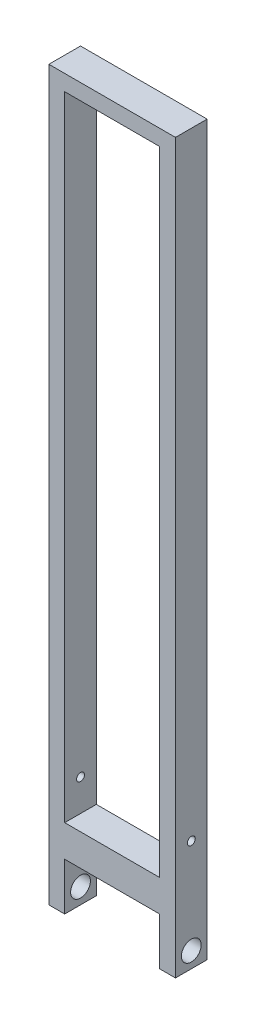
ISO-10303-21;
HEADER;
FILE_DESCRIPTION(('STEP AP214'),'2;1');
FILE_NAME('part.step','',(''),(''),'','','');
FILE_SCHEMA(('AUTOMOTIVE_DESIGN { 1 0 10303 214 1 1 1 1 }'));
ENDSEC;
DATA;
#1=APPLICATION_CONTEXT('core data for automotive mechanical design processes');
#2=APPLICATION_PROTOCOL_DEFINITION('international standard','automotive_design',2000,#1);
#3=PRODUCT_CONTEXT('',#1,'mechanical');
#4=PRODUCT('Part','Part','',(#3));
#5=PRODUCT_RELATED_PRODUCT_CATEGORY('part','',(#4));
#6=PRODUCT_DEFINITION_FORMATION('','',#4);
#7=PRODUCT_DEFINITION_CONTEXT('part definition',#1,'design');
#8=PRODUCT_DEFINITION('design','',#6,#7);
#9=PRODUCT_DEFINITION_SHAPE('','',#8);
#10=(LENGTH_UNIT() NAMED_UNIT(*) SI_UNIT(.MILLI.,.METRE.));
#11=(NAMED_UNIT(*) PLANE_ANGLE_UNIT() SI_UNIT($,.RADIAN.));
#12=(NAMED_UNIT(*) SI_UNIT($,.STERADIAN.) SOLID_ANGLE_UNIT());
#13=UNCERTAINTY_MEASURE_WITH_UNIT(LENGTH_MEASURE(1.E-05),#10,'distance_accuracy_value','');
#14=(GEOMETRIC_REPRESENTATION_CONTEXT(3) GLOBAL_UNCERTAINTY_ASSIGNED_CONTEXT((#13)) GLOBAL_UNIT_ASSIGNED_CONTEXT((#10,
#11,#12)) REPRESENTATION_CONTEXT('',''));
#15=CARTESIAN_POINT('',(0.,0.,0.));
#16=DIRECTION('',(0.,0.,1.));
#17=DIRECTION('',(1.,0.,0.));
#18=AXIS2_PLACEMENT_3D('',#15,#16,#17);
#19=CARTESIAN_POINT('',(0.,0.,50.8));
#20=DIRECTION('',(0.,0.,-1.));
#21=DIRECTION('',(-1.,0.,0.));
#22=AXIS2_PLACEMENT_3D('',#19,#20,#21);
#23=PLANE('',#22);
#24=DIRECTION('',(0.,-1.,0.));
#25=VECTOR('',#24,1.);
#26=CARTESIAN_POINT('',(76.2,-101.6,50.8));
#27=LINE('',#26,#25);
#28=CARTESIAN_POINT('',(76.2,-25.4,50.8));
#29=VERTEX_POINT('',#28);
#30=CARTESIAN_POINT('',(76.2,-101.6,50.8));
#31=VERTEX_POINT('',#30);
#32=EDGE_CURVE('E162',#29,#31,#27,.T.);
#33=ORIENTED_EDGE('',*,*,#32,.T.);
#34=DIRECTION('',(1.,0.,0.));
#35=VECTOR('',#34,1.);
#36=CARTESIAN_POINT('',(76.2,-101.6,50.8));
#37=LINE('',#36,#35);
#38=CARTESIAN_POINT('',(101.6,-101.6,50.8));
#39=VERTEX_POINT('',#38);
#40=EDGE_CURVE('E165',#31,#39,#37,.T.);
#41=ORIENTED_EDGE('',*,*,#40,.T.);
#42=DIRECTION('',(0.,1.,0.));
#43=VECTOR('',#42,1.);
#44=CARTESIAN_POINT('',(101.6,-101.6,50.8));
#45=LINE('',#44,#43);
#46=CARTESIAN_POINT('',(101.6,1066.8,50.8));
#47=VERTEX_POINT('',#46);
#48=EDGE_CURVE('E168',#39,#47,#45,.T.);
#49=ORIENTED_EDGE('',*,*,#48,.T.);
#50=DIRECTION('',(-1.,0.,0.));
#51=VECTOR('',#50,1.);
#52=CARTESIAN_POINT('',(101.6,1066.8,50.8));
#53=LINE('',#52,#51);
#54=CARTESIAN_POINT('',(-101.6,1066.8,50.8));
#55=VERTEX_POINT('',#54);
#56=EDGE_CURVE('E170',#47,#55,#53,.T.);
#57=ORIENTED_EDGE('',*,*,#56,.T.);
#58=DIRECTION('',(0.,-1.,0.));
#59=VECTOR('',#58,1.);
#60=CARTESIAN_POINT('',(-101.6,1066.8,50.8));
#61=LINE('',#60,#59);
#62=CARTESIAN_POINT('',(-101.6,-101.6,50.8));
#63=VERTEX_POINT('',#62);
#64=EDGE_CURVE('E172',#55,#63,#61,.T.);
#65=ORIENTED_EDGE('',*,*,#64,.T.);
#66=DIRECTION('',(1.,0.,0.));
#67=VECTOR('',#66,1.);
#68=CARTESIAN_POINT('',(-76.2,-101.6,50.8));
#69=LINE('',#68,#67);
#70=CARTESIAN_POINT('',(-76.2,-101.6,50.8));
#71=VERTEX_POINT('',#70);
#72=EDGE_CURVE('E174',#63,#71,#69,.T.);
#73=ORIENTED_EDGE('',*,*,#72,.T.);
#74=DIRECTION('',(0.,1.,0.));
#75=VECTOR('',#74,1.);
#76=CARTESIAN_POINT('',(-76.2,-25.4,50.8));
#77=LINE('',#76,#75);
#78=CARTESIAN_POINT('',(-76.2,-25.4,50.8));
#79=VERTEX_POINT('',#78);
#80=EDGE_CURVE('E176',#71,#79,#77,.T.);
#81=ORIENTED_EDGE('',*,*,#80,.T.);
#82=DIRECTION('',(1.,0.,0.));
#83=VECTOR('',#82,1.);
#84=CARTESIAN_POINT('',(-76.2,-25.4,50.8));
#85=LINE('',#84,#83);
#86=EDGE_CURVE('E178',#79,#29,#85,.T.);
#87=ORIENTED_EDGE('',*,*,#86,.T.);
#88=EDGE_LOOP('',(#33,#41,#49,#57,#65,#73,#81,#87));
#89=FACE_BOUND('',#88,.T.);
#90=DIRECTION('',(0.,-1.,0.));
#91=VECTOR('',#90,1.);
#92=CARTESIAN_POINT('',(-76.2000000000001,1041.4,50.8));
#93=LINE('',#92,#91);
#94=CARTESIAN_POINT('',(-76.2000000000001,1041.4,50.8));
#95=VERTEX_POINT('',#94);
#96=CARTESIAN_POINT('',(-76.2,25.4,50.8));
#97=VERTEX_POINT('',#96);
#98=EDGE_CURVE('E124',#95,#97,#93,.T.);
#99=ORIENTED_EDGE('',*,*,#98,.F.);
#100=DIRECTION('',(-1.,0.,0.));
#101=VECTOR('',#100,1.);
#102=CARTESIAN_POINT('',(76.2,1041.4,50.8));
#103=LINE('',#102,#101);
#104=CARTESIAN_POINT('',(76.2,1041.4,50.8));
#105=VERTEX_POINT('',#104);
#106=EDGE_CURVE('E146',#105,#95,#103,.T.);
#107=ORIENTED_EDGE('',*,*,#106,.F.);
#108=DIRECTION('',(0.,1.,0.));
#109=VECTOR('',#108,1.);
#110=CARTESIAN_POINT('',(76.2,25.4,50.8));
#111=LINE('',#110,#109);
#112=CARTESIAN_POINT('',(76.2,25.4,50.8));
#113=VERTEX_POINT('',#112);
#114=EDGE_CURVE('E144',#113,#105,#111,.T.);
#115=ORIENTED_EDGE('',*,*,#114,.F.);
#116=DIRECTION('',(1.,0.,0.));
#117=VECTOR('',#116,1.);
#118=CARTESIAN_POINT('',(-76.2,25.4,50.8));
#119=LINE('',#118,#117);
#120=EDGE_CURVE('E132',#97,#113,#119,.T.);
#121=ORIENTED_EDGE('',*,*,#120,.F.);
#122=EDGE_LOOP('',(#99,#107,#115,#121));
#123=FACE_BOUND('',#122,.T.);
#124=ADVANCED_FACE('F33',(#89,#123),#23,.F.);
#125=CARTESIAN_POINT('',(0.,0.,0.));
#126=DIRECTION('',(0.,0.,-1.));
#127=DIRECTION('',(-1.,0.,0.));
#128=AXIS2_PLACEMENT_3D('',#125,#126,#127);
#129=PLANE('',#128);
#130=DIRECTION('',(0.,-1.,0.));
#131=VECTOR('',#130,1.);
#132=CARTESIAN_POINT('',(76.2,-101.6,0.));
#133=LINE('',#132,#131);
#134=CARTESIAN_POINT('',(76.2,-25.4,0.));
#135=VERTEX_POINT('',#134);
#136=CARTESIAN_POINT('',(76.2,-101.6,0.));
#137=VERTEX_POINT('',#136);
#138=EDGE_CURVE('E140',#135,#137,#133,.T.);
#139=ORIENTED_EDGE('',*,*,#138,.F.);
#140=DIRECTION('',(1.,0.,0.));
#141=VECTOR('',#140,1.);
#142=CARTESIAN_POINT('',(-76.2,-25.4,0.));
#143=LINE('',#142,#141);
#144=CARTESIAN_POINT('',(-76.2,-25.4,0.));
#145=VERTEX_POINT('',#144);
#146=EDGE_CURVE('E166',#145,#135,#143,.T.);
#147=ORIENTED_EDGE('',*,*,#146,.F.);
#148=DIRECTION('',(0.,1.,0.));
#149=VECTOR('',#148,1.);
#150=CARTESIAN_POINT('',(-76.2,-25.4,0.));
#151=LINE('',#150,#149);
#152=CARTESIAN_POINT('',(-76.2,-101.6,0.));
#153=VERTEX_POINT('',#152);
#154=EDGE_CURVE('E193',#153,#145,#151,.T.);
#155=ORIENTED_EDGE('',*,*,#154,.F.);
#156=DIRECTION('',(1.,0.,0.));
#157=VECTOR('',#156,1.);
#158=CARTESIAN_POINT('',(-76.2,-101.6,0.));
#159=LINE('',#158,#157);
#160=CARTESIAN_POINT('',(-101.6,-101.6,0.));
#161=VERTEX_POINT('',#160);
#162=EDGE_CURVE('E191',#161,#153,#159,.T.);
#163=ORIENTED_EDGE('',*,*,#162,.F.);
#164=DIRECTION('',(0.,-1.,0.));
#165=VECTOR('',#164,1.);
#166=CARTESIAN_POINT('',(-101.6,1066.8,0.));
#167=LINE('',#166,#165);
#168=CARTESIAN_POINT('',(-101.6,1066.8,0.));
#169=VERTEX_POINT('',#168);
#170=EDGE_CURVE('E189',#169,#161,#167,.T.);
#171=ORIENTED_EDGE('',*,*,#170,.F.);
#172=DIRECTION('',(-1.,0.,0.));
#173=VECTOR('',#172,1.);
#174=CARTESIAN_POINT('',(101.6,1066.8,0.));
#175=LINE('',#174,#173);
#176=CARTESIAN_POINT('',(101.6,1066.8,0.));
#177=VERTEX_POINT('',#176);
#178=EDGE_CURVE('E187',#177,#169,#175,.T.);
#179=ORIENTED_EDGE('',*,*,#178,.F.);
#180=DIRECTION('',(0.,1.,0.));
#181=VECTOR('',#180,1.);
#182=CARTESIAN_POINT('',(101.6,-101.6,0.));
#183=LINE('',#182,#181);
#184=CARTESIAN_POINT('',(101.6,-101.6,0.));
#185=VERTEX_POINT('',#184);
#186=EDGE_CURVE('E185',#185,#177,#183,.T.);
#187=ORIENTED_EDGE('',*,*,#186,.F.);
#188=DIRECTION('',(1.,0.,0.));
#189=VECTOR('',#188,1.);
#190=CARTESIAN_POINT('',(76.2,-101.6,0.));
#191=LINE('',#190,#189);
#192=EDGE_CURVE('E183',#137,#185,#191,.T.);
#193=ORIENTED_EDGE('',*,*,#192,.F.);
#194=EDGE_LOOP('',(#139,#147,#155,#163,#171,#179,#187,#193));
#195=FACE_BOUND('',#194,.T.);
#196=DIRECTION('',(-1.,0.,0.));
#197=VECTOR('',#196,1.);
#198=CARTESIAN_POINT('',(76.2,1041.4,0.));
#199=LINE('',#198,#197);
#200=CARTESIAN_POINT('',(76.2,1041.4,0.));
#201=VERTEX_POINT('',#200);
#202=CARTESIAN_POINT('',(-76.2000000000001,1041.4,0.));
#203=VERTEX_POINT('',#202);
#204=EDGE_CURVE('E133',#201,#203,#199,.T.);
#205=ORIENTED_EDGE('',*,*,#204,.T.);
#206=DIRECTION('',(0.,-1.,0.));
#207=VECTOR('',#206,1.);
#208=CARTESIAN_POINT('',(-76.2000000000001,1041.4,0.));
#209=LINE('',#208,#207);
#210=CARTESIAN_POINT('',(-76.2,25.4,0.));
#211=VERTEX_POINT('',#210);
#212=EDGE_CURVE('E58',#203,#211,#209,.T.);
#213=ORIENTED_EDGE('',*,*,#212,.T.);
#214=DIRECTION('',(1.,0.,0.));
#215=VECTOR('',#214,1.);
#216=CARTESIAN_POINT('',(-76.2,25.4,0.));
#217=LINE('',#216,#215);
#218=CARTESIAN_POINT('',(76.2,25.4,0.));
#219=VERTEX_POINT('',#218);
#220=EDGE_CURVE('E139',#211,#219,#217,.T.);
#221=ORIENTED_EDGE('',*,*,#220,.T.);
#222=DIRECTION('',(0.,1.,0.));
#223=VECTOR('',#222,1.);
#224=CARTESIAN_POINT('',(76.2,25.4,0.));
#225=LINE('',#224,#223);
#226=EDGE_CURVE('E154',#219,#201,#225,.T.);
#227=ORIENTED_EDGE('',*,*,#226,.T.);
#228=EDGE_LOOP('',(#205,#213,#221,#227));
#229=FACE_BOUND('',#228,.T.);
#230=ADVANCED_FACE('F251',(#195,#229),#129,.T.);
#231=CARTESIAN_POINT('',(76.2,-101.6,50.8));
#232=DIRECTION('',(1.,0.,0.));
#233=DIRECTION('',(0.,0.,-1.));
#234=AXIS2_PLACEMENT_3D('',#231,#232,#233);
#235=PLANE('',#234);
#236=CARTESIAN_POINT('',(76.2,-76.2,25.4));
#237=DIRECTION('',(1.,0.,0.));
#238=DIRECTION('',(0.,0.,-1.));
#239=AXIS2_PLACEMENT_3D('',#236,#237,#238);
#240=CIRCLE('',#239,15.875);
#241=CARTESIAN_POINT('',(76.2,-76.2,9.52499999999999));
#242=VERTEX_POINT('',#241);
#243=EDGE_CURVE('E152',#242,#242,#240,.T.);
#244=ORIENTED_EDGE('',*,*,#243,.T.);
#245=EDGE_LOOP('',(#244));
#246=FACE_BOUND('',#245,.T.);
#247=ORIENTED_EDGE('',*,*,#138,.T.);
#248=DIRECTION('',(0.,0.,-1.));
#249=VECTOR('',#248,1.);
#250=CARTESIAN_POINT('',(76.2,-101.6,50.8));
#251=LINE('',#250,#249);
#252=EDGE_CURVE('E11',#31,#137,#251,.T.);
#253=ORIENTED_EDGE('',*,*,#252,.F.);
#254=ORIENTED_EDGE('',*,*,#32,.F.);
#255=DIRECTION('',(0.,0.,-1.));
#256=VECTOR('',#255,1.);
#257=CARTESIAN_POINT('',(76.2,-25.4,50.8));
#258=LINE('',#257,#256);
#259=EDGE_CURVE('E180',#29,#135,#258,.T.);
#260=ORIENTED_EDGE('',*,*,#259,.T.);
#261=EDGE_LOOP('',(#247,#253,#254,#260));
#262=FACE_BOUND('',#261,.T.);
#263=ADVANCED_FACE('F35',(#246,#262),#235,.F.);
#264=CARTESIAN_POINT('',(76.2,-101.6,50.8));
#265=DIRECTION('',(0.,1.,0.));
#266=DIRECTION('',(0.,0.,1.));
#267=AXIS2_PLACEMENT_3D('',#264,#265,#266);
#268=PLANE('',#267);
#269=ORIENTED_EDGE('',*,*,#192,.T.);
#270=DIRECTION('',(0.,0.,-1.));
#271=VECTOR('',#270,1.);
#272=CARTESIAN_POINT('',(101.6,-101.6,50.8));
#273=LINE('',#272,#271);
#274=EDGE_CURVE('E42',#39,#185,#273,.T.);
#275=ORIENTED_EDGE('',*,*,#274,.F.);
#276=ORIENTED_EDGE('',*,*,#40,.F.);
#277=ORIENTED_EDGE('',*,*,#252,.T.);
#278=EDGE_LOOP('',(#269,#275,#276,#277));
#279=FACE_BOUND('',#278,.T.);
#280=ADVANCED_FACE('F292',(#279),#268,.F.);
#281=CARTESIAN_POINT('',(101.6,-101.6,50.8));
#282=DIRECTION('',(-1.,0.,0.));
#283=DIRECTION('',(0.,0.,1.));
#284=AXIS2_PLACEMENT_3D('',#281,#282,#283);
#285=PLANE('',#284);
#286=CARTESIAN_POINT('',(101.6,76.2,25.4));
#287=DIRECTION('',(1.,0.,0.));
#288=DIRECTION('',(0.,0.,-1.));
#289=AXIS2_PLACEMENT_3D('',#286,#287,#288);
#290=CIRCLE('',#289,6.35);
#291=CARTESIAN_POINT('',(101.6,76.2,19.05));
#292=VERTEX_POINT('',#291);
#293=EDGE_CURVE('E231',#292,#292,#290,.T.);
#294=ORIENTED_EDGE('',*,*,#293,.F.);
#295=EDGE_LOOP('',(#294));
#296=FACE_BOUND('',#295,.T.);
#297=CARTESIAN_POINT('',(101.6,-76.2,25.4));
#298=DIRECTION('',(1.,0.,0.));
#299=DIRECTION('',(0.,0.,-1.));
#300=AXIS2_PLACEMENT_3D('',#297,#298,#299);
#301=CIRCLE('',#300,15.875);
#302=CARTESIAN_POINT('',(101.6,-76.2,9.52499999999999));
#303=VERTEX_POINT('',#302);
#304=EDGE_CURVE('E221',#303,#303,#301,.T.);
#305=ORIENTED_EDGE('',*,*,#304,.F.);
#306=EDGE_LOOP('',(#305));
#307=FACE_BOUND('',#306,.T.);
#308=ORIENTED_EDGE('',*,*,#186,.T.);
#309=DIRECTION('',(0.,0.,-1.));
#310=VECTOR('',#309,1.);
#311=CARTESIAN_POINT('',(101.6,1066.8,50.8));
#312=LINE('',#311,#310);
#313=EDGE_CURVE('E210',#47,#177,#312,.T.);
#314=ORIENTED_EDGE('',*,*,#313,.F.);
#315=ORIENTED_EDGE('',*,*,#48,.F.);
#316=ORIENTED_EDGE('',*,*,#274,.T.);
#317=EDGE_LOOP('',(#308,#314,#315,#316));
#318=FACE_BOUND('',#317,.T.);
#319=ADVANCED_FACE('F289',(#296,#307,#318),#285,.F.);
#320=CARTESIAN_POINT('',(101.6,1066.8,50.8));
#321=DIRECTION('',(0.,-1.,0.));
#322=DIRECTION('',(1.,0.,0.));
#323=AXIS2_PLACEMENT_3D('',#320,#321,#322);
#324=PLANE('',#323);
#325=ORIENTED_EDGE('',*,*,#178,.T.);
#326=DIRECTION('',(0.,0.,-1.));
#327=VECTOR('',#326,1.);
#328=CARTESIAN_POINT('',(-101.6,1066.8,50.8));
#329=LINE('',#328,#327);
#330=EDGE_CURVE('E207',#55,#169,#329,.T.);
#331=ORIENTED_EDGE('',*,*,#330,.F.);
#332=ORIENTED_EDGE('',*,*,#56,.F.);
#333=ORIENTED_EDGE('',*,*,#313,.T.);
#334=EDGE_LOOP('',(#325,#331,#332,#333));
#335=FACE_BOUND('',#334,.T.);
#336=ADVANCED_FACE('F286',(#335),#324,.F.);
#337=CARTESIAN_POINT('',(-101.6,1066.8,50.8));
#338=DIRECTION('',(1.,0.,0.));
#339=DIRECTION('',(0.,1.,0.));
#340=AXIS2_PLACEMENT_3D('',#337,#338,#339);
#341=PLANE('',#340);
#342=CARTESIAN_POINT('',(-101.6,76.2,25.4));
#343=DIRECTION('',(1.,0.,0.));
#344=DIRECTION('',(0.,0.,-1.));
#345=AXIS2_PLACEMENT_3D('',#342,#343,#344);
#346=CIRCLE('',#345,6.35);
#347=CARTESIAN_POINT('',(-101.6,76.2,19.05));
#348=VERTEX_POINT('',#347);
#349=EDGE_CURVE('E234',#348,#348,#346,.T.);
#350=ORIENTED_EDGE('',*,*,#349,.T.);
#351=EDGE_LOOP('',(#350));
#352=FACE_BOUND('',#351,.T.);
#353=CARTESIAN_POINT('',(-101.6,-76.2,25.4));
#354=DIRECTION('',(1.,0.,0.));
#355=DIRECTION('',(0.,0.,-1.));
#356=AXIS2_PLACEMENT_3D('',#353,#354,#355);
#357=CIRCLE('',#356,15.875);
#358=CARTESIAN_POINT('',(-101.6,-76.2,9.52499999999999));
#359=VERTEX_POINT('',#358);
#360=EDGE_CURVE('E216',#359,#359,#357,.T.);
#361=ORIENTED_EDGE('',*,*,#360,.T.);
#362=EDGE_LOOP('',(#361));
#363=FACE_BOUND('',#362,.T.);
#364=ORIENTED_EDGE('',*,*,#170,.T.);
#365=DIRECTION('',(0.,0.,-1.));
#366=VECTOR('',#365,1.);
#367=CARTESIAN_POINT('',(-101.6,-101.6,50.8));
#368=LINE('',#367,#366);
#369=EDGE_CURVE('E204',#63,#161,#368,.T.);
#370=ORIENTED_EDGE('',*,*,#369,.F.);
#371=ORIENTED_EDGE('',*,*,#64,.F.);
#372=ORIENTED_EDGE('',*,*,#330,.T.);
#373=EDGE_LOOP('',(#364,#370,#371,#372));
#374=FACE_BOUND('',#373,.T.);
#375=ADVANCED_FACE('F282',(#352,#363,#374),#341,.F.);
#376=CARTESIAN_POINT('',(-76.2,-101.6,50.8));
#377=DIRECTION('',(0.,1.,0.));
#378=DIRECTION('',(-1.,0.,0.));
#379=AXIS2_PLACEMENT_3D('',#376,#377,#378);
#380=PLANE('',#379);
#381=ORIENTED_EDGE('',*,*,#162,.T.);
#382=DIRECTION('',(0.,0.,-1.));
#383=VECTOR('',#382,1.);
#384=CARTESIAN_POINT('',(-76.2,-101.6,50.8));
#385=LINE('',#384,#383);
#386=EDGE_CURVE('E201',#71,#153,#385,.T.);
#387=ORIENTED_EDGE('',*,*,#386,.F.);
#388=ORIENTED_EDGE('',*,*,#72,.F.);
#389=ORIENTED_EDGE('',*,*,#369,.T.);
#390=EDGE_LOOP('',(#381,#387,#388,#389));
#391=FACE_BOUND('',#390,.T.);
#392=ADVANCED_FACE('F279',(#391),#380,.F.);
#393=CARTESIAN_POINT('',(-76.2,-25.4,50.8));
#394=DIRECTION('',(-1.,0.,0.));
#395=DIRECTION('',(0.,-1.,0.));
#396=AXIS2_PLACEMENT_3D('',#393,#394,#395);
#397=PLANE('',#396);
#398=CARTESIAN_POINT('',(-76.2,-76.2,25.4));
#399=DIRECTION('',(-1.,0.,0.));
#400=DIRECTION('',(0.,-1.,0.));
#401=AXIS2_PLACEMENT_3D('',#398,#399,#400);
#402=CIRCLE('',#401,15.875);
#403=CARTESIAN_POINT('',(-76.2,-92.075,25.4));
#404=VERTEX_POINT('',#403);
#405=EDGE_CURVE('E214',#404,#404,#402,.T.);
#406=ORIENTED_EDGE('',*,*,#405,.T.);
#407=EDGE_LOOP('',(#406));
#408=FACE_BOUND('',#407,.T.);
#409=ORIENTED_EDGE('',*,*,#154,.T.);
#410=DIRECTION('',(0.,0.,-1.));
#411=VECTOR('',#410,1.);
#412=CARTESIAN_POINT('',(-76.2,-25.4,50.8));
#413=LINE('',#412,#411);
#414=EDGE_CURVE('E198',#79,#145,#413,.T.);
#415=ORIENTED_EDGE('',*,*,#414,.F.);
#416=ORIENTED_EDGE('',*,*,#80,.F.);
#417=ORIENTED_EDGE('',*,*,#386,.T.);
#418=EDGE_LOOP('',(#409,#415,#416,#417));
#419=FACE_BOUND('',#418,.T.);
#420=ADVANCED_FACE('F275',(#408,#419),#397,.F.);
#421=CARTESIAN_POINT('',(-76.2,-25.4,50.8));
#422=DIRECTION('',(0.,1.,0.));
#423=DIRECTION('',(-1.,0.,0.));
#424=AXIS2_PLACEMENT_3D('',#421,#422,#423);
#425=PLANE('',#424);
#426=ORIENTED_EDGE('',*,*,#146,.T.);
#427=ORIENTED_EDGE('',*,*,#259,.F.);
#428=ORIENTED_EDGE('',*,*,#86,.F.);
#429=ORIENTED_EDGE('',*,*,#414,.T.);
#430=EDGE_LOOP('',(#426,#427,#428,#429));
#431=FACE_BOUND('',#430,.T.);
#432=ADVANCED_FACE('F272',(#431),#425,.F.);
#433=CARTESIAN_POINT('',(-76.2000000000001,1041.4,50.8));
#434=DIRECTION('',(1.,0.,0.));
#435=DIRECTION('',(0.,1.,0.));
#436=AXIS2_PLACEMENT_3D('',#433,#434,#435);
#437=PLANE('',#436);
#438=CARTESIAN_POINT('',(-76.2,76.2,25.4));
#439=DIRECTION('',(1.,0.,0.));
#440=DIRECTION('',(0.,1.,0.));
#441=AXIS2_PLACEMENT_3D('',#438,#439,#440);
#442=CIRCLE('',#441,6.35);
#443=CARTESIAN_POINT('',(-76.2,82.55,25.4));
#444=VERTEX_POINT('',#443);
#445=EDGE_CURVE('E226',#444,#444,#442,.T.);
#446=ORIENTED_EDGE('',*,*,#445,.F.);
#447=EDGE_LOOP('',(#446));
#448=FACE_BOUND('',#447,.T.);
#449=ORIENTED_EDGE('',*,*,#212,.F.);
#450=DIRECTION('',(0.,0.,-1.));
#451=VECTOR('',#450,1.);
#452=CARTESIAN_POINT('',(-76.2000000000001,1041.4,50.8));
#453=LINE('',#452,#451);
#454=EDGE_CURVE('E128',#95,#203,#453,.T.);
#455=ORIENTED_EDGE('',*,*,#454,.F.);
#456=ORIENTED_EDGE('',*,*,#98,.T.);
#457=DIRECTION('',(0.,0.,-1.));
#458=VECTOR('',#457,1.);
#459=CARTESIAN_POINT('',(-76.2,25.4,50.8));
#460=LINE('',#459,#458);
#461=EDGE_CURVE('E127',#97,#211,#460,.T.);
#462=ORIENTED_EDGE('',*,*,#461,.T.);
#463=EDGE_LOOP('',(#449,#455,#456,#462));
#464=FACE_BOUND('',#463,.T.);
#465=ADVANCED_FACE('F126',(#448,#464),#437,.T.);
#466=CARTESIAN_POINT('',(-76.2,25.4,50.8));
#467=DIRECTION('',(0.,1.,0.));
#468=DIRECTION('',(0.,0.,1.));
#469=AXIS2_PLACEMENT_3D('',#466,#467,#468);
#470=PLANE('',#469);
#471=ORIENTED_EDGE('',*,*,#220,.F.);
#472=ORIENTED_EDGE('',*,*,#461,.F.);
#473=ORIENTED_EDGE('',*,*,#120,.T.);
#474=DIRECTION('',(0.,0.,-1.));
#475=VECTOR('',#474,1.);
#476=CARTESIAN_POINT('',(76.2,25.4,50.8));
#477=LINE('',#476,#475);
#478=EDGE_CURVE('E141',#113,#219,#477,.T.);
#479=ORIENTED_EDGE('',*,*,#478,.T.);
#480=EDGE_LOOP('',(#471,#472,#473,#479));
#481=FACE_BOUND('',#480,.T.);
#482=ADVANCED_FACE('F136',(#481),#470,.T.);
#483=CARTESIAN_POINT('',(76.2,25.4,50.8));
#484=DIRECTION('',(-1.,0.,0.));
#485=DIRECTION('',(0.,-1.,0.));
#486=AXIS2_PLACEMENT_3D('',#483,#484,#485);
#487=PLANE('',#486);
#488=CARTESIAN_POINT('',(76.2,76.2,25.4));
#489=DIRECTION('',(-1.,0.,0.));
#490=DIRECTION('',(0.,-1.,0.));
#491=AXIS2_PLACEMENT_3D('',#488,#489,#490);
#492=CIRCLE('',#491,6.35);
#493=CARTESIAN_POINT('',(76.2,69.85,25.4));
#494=VERTEX_POINT('',#493);
#495=EDGE_CURVE('E37',#494,#494,#492,.T.);
#496=ORIENTED_EDGE('',*,*,#495,.F.);
#497=EDGE_LOOP('',(#496));
#498=FACE_BOUND('',#497,.T.);
#499=ORIENTED_EDGE('',*,*,#226,.F.);
#500=ORIENTED_EDGE('',*,*,#478,.F.);
#501=ORIENTED_EDGE('',*,*,#114,.T.);
#502=DIRECTION('',(0.,0.,-1.));
#503=VECTOR('',#502,1.);
#504=CARTESIAN_POINT('',(76.2,1041.4,50.8));
#505=LINE('',#504,#503);
#506=EDGE_CURVE('E50',#105,#201,#505,.T.);
#507=ORIENTED_EDGE('',*,*,#506,.T.);
#508=EDGE_LOOP('',(#499,#500,#501,#507));
#509=FACE_BOUND('',#508,.T.);
#510=ADVANCED_FACE('F244',(#498,#509),#487,.T.);
#511=CARTESIAN_POINT('',(76.2,1041.4,50.8));
#512=DIRECTION('',(0.,-1.,0.));
#513=DIRECTION('',(0.,0.,-1.));
#514=AXIS2_PLACEMENT_3D('',#511,#512,#513);
#515=PLANE('',#514);
#516=ORIENTED_EDGE('',*,*,#204,.F.);
#517=ORIENTED_EDGE('',*,*,#506,.F.);
#518=ORIENTED_EDGE('',*,*,#106,.T.);
#519=ORIENTED_EDGE('',*,*,#454,.T.);
#520=EDGE_LOOP('',(#516,#517,#518,#519));
#521=FACE_BOUND('',#520,.T.);
#522=ADVANCED_FACE('F247',(#521),#515,.T.);
#523=CARTESIAN_POINT('',(-101.6,-76.2,25.4));
#524=DIRECTION('',(1.,0.,0.));
#525=DIRECTION('',(0.,0.,-1.));
#526=AXIS2_PLACEMENT_3D('',#523,#524,#525);
#527=CYLINDRICAL_SURFACE('',#526,15.875);
#528=ORIENTED_EDGE('',*,*,#360,.F.);
#529=EDGE_LOOP('',(#528));
#530=FACE_BOUND('',#529,.T.);
#531=ORIENTED_EDGE('',*,*,#405,.F.);
#532=EDGE_LOOP('',(#531));
#533=FACE_BOUND('',#532,.T.);
#534=ADVANCED_FACE('F253',(#530,#533),#527,.F.);
#535=ORIENTED_EDGE('',*,*,#304,.T.);
#536=EDGE_LOOP('',(#535));
#537=FACE_BOUND('',#536,.T.);
#538=ORIENTED_EDGE('',*,*,#243,.F.);
#539=EDGE_LOOP('',(#538));
#540=FACE_BOUND('',#539,.T.);
#541=ADVANCED_FACE('F258',(#537,#540),#527,.F.);
#542=CARTESIAN_POINT('',(-101.6,76.2,25.4));
#543=DIRECTION('',(1.,0.,0.));
#544=DIRECTION('',(0.,0.,-1.));
#545=AXIS2_PLACEMENT_3D('',#542,#543,#544);
#546=CYLINDRICAL_SURFACE('',#545,6.35);
#547=ORIENTED_EDGE('',*,*,#495,.T.);
#548=EDGE_LOOP('',(#547));
#549=FACE_BOUND('',#548,.T.);
#550=ORIENTED_EDGE('',*,*,#293,.T.);
#551=EDGE_LOOP('',(#550));
#552=FACE_BOUND('',#551,.T.);
#553=ADVANCED_FACE('F241',(#549,#552),#546,.F.);
#554=ORIENTED_EDGE('',*,*,#445,.T.);
#555=EDGE_LOOP('',(#554));
#556=FACE_BOUND('',#555,.T.);
#557=ORIENTED_EDGE('',*,*,#349,.F.);
#558=EDGE_LOOP('',(#557));
#559=FACE_BOUND('',#558,.T.);
#560=ADVANCED_FACE('F335',(#556,#559),#546,.F.);
#561=CLOSED_SHELL('',(#124,#230,#263,#280,#319,#336,#375,#392,#420,#432,#465,#482,#510,#522,
#534,#541,#553,#560));
#562=MANIFOLD_SOLID_BREP('B2',#561);
#563=ADVANCED_BREP_SHAPE_REPRESENTATION('',(#18,#562),#14);
#564=SHAPE_DEFINITION_REPRESENTATION(#9,#563);
ENDSEC;
END-ISO-10303-21;
